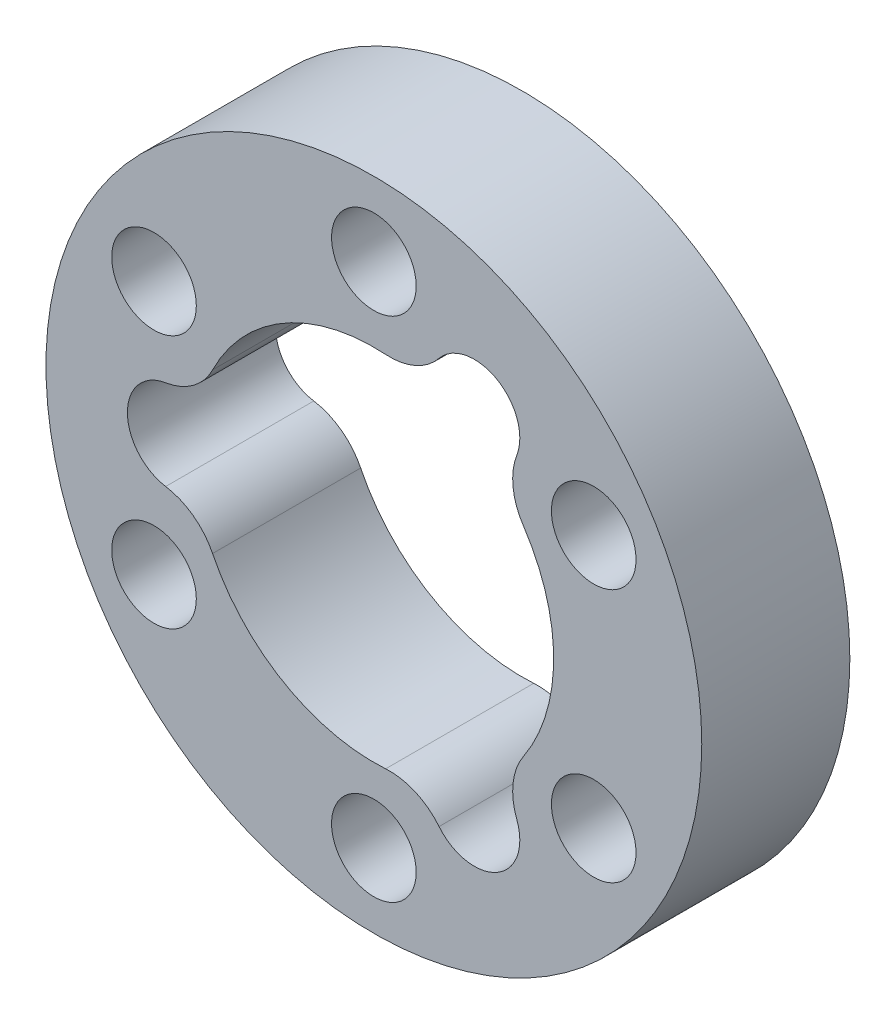
ISO-10303-21;
HEADER;
FILE_DESCRIPTION(('STEP AP214'),'2;1');
FILE_NAME('part.step','',(''),(''),'','','');
FILE_SCHEMA(('AUTOMOTIVE_DESIGN { 1 0 10303 214 1 1 1 1 }'));
ENDSEC;
DATA;
#1=APPLICATION_CONTEXT('core data for automotive mechanical design processes');
#2=APPLICATION_PROTOCOL_DEFINITION('international standard','automotive_design',2000,#1);
#3=PRODUCT_CONTEXT('',#1,'mechanical');
#4=PRODUCT('Part','Part','',(#3));
#5=PRODUCT_RELATED_PRODUCT_CATEGORY('part','',(#4));
#6=PRODUCT_DEFINITION_FORMATION('','',#4);
#7=PRODUCT_DEFINITION_CONTEXT('part definition',#1,'design');
#8=PRODUCT_DEFINITION('design','',#6,#7);
#9=PRODUCT_DEFINITION_SHAPE('','',#8);
#10=(LENGTH_UNIT() NAMED_UNIT(*) SI_UNIT(.MILLI.,.METRE.));
#11=(NAMED_UNIT(*) PLANE_ANGLE_UNIT() SI_UNIT($,.RADIAN.));
#12=(NAMED_UNIT(*) SI_UNIT($,.STERADIAN.) SOLID_ANGLE_UNIT());
#13=UNCERTAINTY_MEASURE_WITH_UNIT(LENGTH_MEASURE(1.E-05),#10,'distance_accuracy_value','');
#14=(GEOMETRIC_REPRESENTATION_CONTEXT(3) GLOBAL_UNCERTAINTY_ASSIGNED_CONTEXT((#13)) GLOBAL_UNIT_ASSIGNED_CONTEXT((#10,
#11,#12)) REPRESENTATION_CONTEXT('',''));
#15=CARTESIAN_POINT('',(0.,0.,0.));
#16=DIRECTION('',(0.,0.,1.));
#17=DIRECTION('',(1.,0.,0.));
#18=AXIS2_PLACEMENT_3D('',#15,#16,#17);
#19=CARTESIAN_POINT('',(0.,0.,7.));
#20=DIRECTION('',(0.,0.,-1.));
#21=DIRECTION('',(-1.,0.,0.));
#22=AXIS2_PLACEMENT_3D('',#19,#20,#21);
#23=CYLINDRICAL_SURFACE('',#22,8.5);
#24=CARTESIAN_POINT('',(0.,0.,0.));
#25=DIRECTION('',(0.,0.,1.));
#26=DIRECTION('',(1.,0.,0.));
#27=AXIS2_PLACEMENT_3D('',#24,#25,#26);
#28=CIRCLE('',#27,8.5);
#29=CARTESIAN_POINT('',(0.556875109542722,8.48173862556326,0.));
#30=VERTEX_POINT('',#29);
#31=CARTESIAN_POINT('',(-7.6238386727689,3.75860132118229,0.));
#32=VERTEX_POINT('',#31);
#33=EDGE_CURVE('E142',#30,#32,#28,.T.);
#34=ORIENTED_EDGE('',*,*,#33,.F.);
#35=DIRECTION('',(0.,0.,-1.));
#36=VECTOR('',#35,1.);
#37=CARTESIAN_POINT('',(0.556875109542722,8.48173862556326,7.));
#38=LINE('',#37,#36);
#39=CARTESIAN_POINT('',(0.556875109542722,8.48173862556326,7.));
#40=VERTEX_POINT('',#39);
#41=EDGE_CURVE('E11',#30,#40,#38,.F.);
#42=ORIENTED_EDGE('',*,*,#41,.T.);
#43=CARTESIAN_POINT('',(0.,0.,7.));
#44=DIRECTION('',(0.,0.,1.));
#45=DIRECTION('',(1.,0.,0.));
#46=AXIS2_PLACEMENT_3D('',#43,#44,#45);
#47=CIRCLE('',#46,8.5);
#48=CARTESIAN_POINT('',(-7.6238386727689,3.75860132118229,7.));
#49=VERTEX_POINT('',#48);
#50=EDGE_CURVE('E238',#40,#49,#47,.T.);
#51=ORIENTED_EDGE('',*,*,#50,.T.);
#52=DIRECTION('',(0.,0.,-1.));
#53=VECTOR('',#52,1.);
#54=CARTESIAN_POINT('',(-7.6238386727689,3.75860132118229,7.));
#55=LINE('',#54,#53);
#56=EDGE_CURVE('E54',#49,#32,#55,.T.);
#57=ORIENTED_EDGE('',*,*,#56,.T.);
#58=EDGE_LOOP('',(#34,#42,#51,#57));
#59=FACE_BOUND('',#58,.T.);
#60=ADVANCED_FACE('F45',(#59),#23,.F.);
#61=CARTESIAN_POINT('',(4.74999999999995,8.2272413359522,7.));
#62=DIRECTION('',(0.,0.,-1.));
#63=DIRECTION('',(-1.,0.,0.));
#64=AXIS2_PLACEMENT_3D('',#61,#62,#63);
#65=CYLINDRICAL_SURFACE('',#64,2.15);
#66=CARTESIAN_POINT('',(4.74999999999995,8.2272413359522,0.));
#67=DIRECTION('',(0.,0.,1.));
#68=DIRECTION('',(1.,0.,0.));
#69=AXIS2_PLACEMENT_3D('',#66,#67,#68);
#70=CIRCLE('',#69,2.15);
#71=CARTESIAN_POINT('',(6.75855337751601,7.46029066630726,0.));
#72=VERTEX_POINT('',#71);
#73=CARTESIAN_POINT('',(3.0815245478799,9.58322425091565,0.));
#74=VERTEX_POINT('',#73);
#75=EDGE_CURVE('E293',#72,#74,#70,.T.);
#76=ORIENTED_EDGE('',*,*,#75,.F.);
#77=DIRECTION('',(0.,0.,-1.));
#78=VECTOR('',#77,1.);
#79=CARTESIAN_POINT('',(6.75855337751601,7.46029066630726,7.));
#80=LINE('',#79,#78);
#81=CARTESIAN_POINT('',(6.75855337751601,7.46029066630726,7.));
#82=VERTEX_POINT('',#81);
#83=EDGE_CURVE('E231',#72,#82,#80,.F.);
#84=ORIENTED_EDGE('',*,*,#83,.T.);
#85=CARTESIAN_POINT('',(4.74999999999995,8.2272413359522,7.));
#86=DIRECTION('',(0.,0.,1.));
#87=DIRECTION('',(1.,0.,0.));
#88=AXIS2_PLACEMENT_3D('',#85,#86,#87);
#89=CIRCLE('',#88,2.15);
#90=CARTESIAN_POINT('',(3.0815245478799,9.58322425091565,7.));
#91=VERTEX_POINT('',#90);
#92=EDGE_CURVE('E241',#82,#91,#89,.T.);
#93=ORIENTED_EDGE('',*,*,#92,.T.);
#94=DIRECTION('',(0.,0.,-1.));
#95=VECTOR('',#94,1.);
#96=CARTESIAN_POINT('',(3.0815245478799,9.58322425091565,7.));
#97=LINE('',#96,#95);
#98=EDGE_CURVE('E227',#91,#74,#97,.T.);
#99=ORIENTED_EDGE('',*,*,#98,.T.);
#100=EDGE_LOOP('',(#76,#84,#93,#99));
#101=FACE_BOUND('',#100,.T.);
#102=ADVANCED_FACE('F343',(#101),#65,.F.);
#103=CARTESIAN_POINT('',(7.06696356322613,-4.72313730438087,0.));
#104=VERTEX_POINT('',#103);
#105=CARTESIAN_POINT('',(7.06696356322608,4.72313730438096,0.));
#106=VERTEX_POINT('',#105);
#107=EDGE_CURVE('E288',#104,#106,#28,.T.);
#108=ORIENTED_EDGE('',*,*,#107,.F.);
#109=DIRECTION('',(0.,0.,-1.));
#110=VECTOR('',#109,1.);
#111=CARTESIAN_POINT('',(7.06696356322613,-4.72313730438087,7.));
#112=LINE('',#111,#110);
#113=CARTESIAN_POINT('',(7.06696356322613,-4.72313730438087,7.));
#114=VERTEX_POINT('',#113);
#115=EDGE_CURVE('E224',#104,#114,#112,.F.);
#116=ORIENTED_EDGE('',*,*,#115,.T.);
#117=CARTESIAN_POINT('',(7.06696356322608,4.72313730438096,7.));
#118=VERTEX_POINT('',#117);
#119=EDGE_CURVE('E244',#114,#118,#47,.T.);
#120=ORIENTED_EDGE('',*,*,#119,.T.);
#121=DIRECTION('',(0.,0.,-1.));
#122=VECTOR('',#121,1.);
#123=CARTESIAN_POINT('',(7.06696356322608,4.72313730438096,7.));
#124=LINE('',#123,#122);
#125=EDGE_CURVE('E220',#118,#106,#124,.T.);
#126=ORIENTED_EDGE('',*,*,#125,.T.);
#127=EDGE_LOOP('',(#108,#116,#120,#126));
#128=FACE_BOUND('',#127,.T.);
#129=ADVANCED_FACE('F340',(#128),#23,.F.);
#130=CARTESIAN_POINT('',(4.75000000000005,-8.22724133595214,7.));
#131=DIRECTION('',(0.,0.,-1.));
#132=DIRECTION('',(-1.,0.,0.));
#133=AXIS2_PLACEMENT_3D('',#130,#131,#132);
#134=CYLINDRICAL_SURFACE('',#133,2.15);
#135=CARTESIAN_POINT('',(4.75000000000005,-8.22724133595214,0.));
#136=DIRECTION('',(0.,0.,1.));
#137=DIRECTION('',(1.,0.,0.));
#138=AXIS2_PLACEMENT_3D('',#135,#136,#137);
#139=CIRCLE('',#138,2.15);
#140=CARTESIAN_POINT('',(3.08152454788002,-9.58322425091561,0.));
#141=VERTEX_POINT('',#140);
#142=CARTESIAN_POINT('',(6.7585533775161,-7.46029066630717,0.));
#143=VERTEX_POINT('',#142);
#144=EDGE_CURVE('E292',#141,#143,#139,.T.);
#145=ORIENTED_EDGE('',*,*,#144,.F.);
#146=DIRECTION('',(0.,0.,-1.));
#147=VECTOR('',#146,1.);
#148=CARTESIAN_POINT('',(3.08152454788002,-9.58322425091561,7.));
#149=LINE('',#148,#147);
#150=CARTESIAN_POINT('',(3.08152454788002,-9.58322425091561,7.));
#151=VERTEX_POINT('',#150);
#152=EDGE_CURVE('E68',#141,#151,#149,.F.);
#153=ORIENTED_EDGE('',*,*,#152,.T.);
#154=CARTESIAN_POINT('',(4.75000000000005,-8.22724133595214,7.));
#155=DIRECTION('',(0.,0.,1.));
#156=DIRECTION('',(1.,0.,0.));
#157=AXIS2_PLACEMENT_3D('',#154,#155,#156);
#158=CIRCLE('',#157,2.15);
#159=CARTESIAN_POINT('',(6.7585533775161,-7.46029066630717,7.));
#160=VERTEX_POINT('',#159);
#161=EDGE_CURVE('E254',#151,#160,#158,.T.);
#162=ORIENTED_EDGE('',*,*,#161,.T.);
#163=DIRECTION('',(0.,0.,-1.));
#164=VECTOR('',#163,1.);
#165=CARTESIAN_POINT('',(6.75855337751611,-7.46029066630717,7.));
#166=LINE('',#165,#164);
#167=EDGE_CURVE('E214',#160,#143,#166,.T.);
#168=ORIENTED_EDGE('',*,*,#167,.T.);
#169=EDGE_LOOP('',(#145,#153,#162,#168));
#170=FACE_BOUND('',#169,.T.);
#171=ADVANCED_FACE('F337',(#170),#134,.F.);
#172=CARTESIAN_POINT('',(-7.62383867276885,-3.7586013211824,0.));
#173=VERTEX_POINT('',#172);
#174=CARTESIAN_POINT('',(0.556875109542829,-8.48173862556326,0.));
#175=VERTEX_POINT('',#174);
#176=EDGE_CURVE('E160',#173,#175,#28,.T.);
#177=ORIENTED_EDGE('',*,*,#176,.F.);
#178=DIRECTION('',(0.,0.,-1.));
#179=VECTOR('',#178,1.);
#180=CARTESIAN_POINT('',(-7.62383867276885,-3.7586013211824,7.));
#181=LINE('',#180,#179);
#182=CARTESIAN_POINT('',(-7.62383867276885,-3.7586013211824,7.));
#183=VERTEX_POINT('',#182);
#184=EDGE_CURVE('E195',#173,#183,#181,.F.);
#185=ORIENTED_EDGE('',*,*,#184,.T.);
#186=CARTESIAN_POINT('',(0.556875109542829,-8.48173862556326,7.));
#187=VERTEX_POINT('',#186);
#188=EDGE_CURVE('E243',#183,#187,#47,.T.);
#189=ORIENTED_EDGE('',*,*,#188,.T.);
#190=DIRECTION('',(0.,0.,-1.));
#191=VECTOR('',#190,1.);
#192=CARTESIAN_POINT('',(0.556875109542829,-8.48173862556326,7.));
#193=LINE('',#192,#191);
#194=EDGE_CURVE('E191',#187,#175,#193,.T.);
#195=ORIENTED_EDGE('',*,*,#194,.T.);
#196=EDGE_LOOP('',(#177,#185,#189,#195));
#197=FACE_BOUND('',#196,.T.);
#198=ADVANCED_FACE('F327',(#197),#23,.F.);
#199=CARTESIAN_POINT('',(-10.3923048454133,5.99999999999999,7.));
#200=DIRECTION('',(0.,0.,-1.));
#201=DIRECTION('',(-1.,0.,0.));
#202=AXIS2_PLACEMENT_3D('',#199,#200,#201);
#203=CYLINDRICAL_SURFACE('',#202,2.);
#204=CARTESIAN_POINT('',(-10.3923048454133,5.99999999999999,7.));
#205=DIRECTION('',(0.,0.,1.));
#206=DIRECTION('',(1.,0.,0.));
#207=AXIS2_PLACEMENT_3D('',#204,#205,#206);
#208=CIRCLE('',#207,2.);
#209=CARTESIAN_POINT('',(-8.39230484541327,5.99999999999999,7.));
#210=VERTEX_POINT('',#209);
#211=EDGE_CURVE('E171',#210,#210,#208,.T.);
#212=ORIENTED_EDGE('',*,*,#211,.T.);
#213=EDGE_LOOP('',(#212));
#214=FACE_BOUND('',#213,.T.);
#215=CARTESIAN_POINT('',(-10.3923048454133,5.99999999999999,0.));
#216=DIRECTION('',(0.,0.,1.));
#217=DIRECTION('',(1.,0.,0.));
#218=AXIS2_PLACEMENT_3D('',#215,#216,#217);
#219=CIRCLE('',#218,2.);
#220=CARTESIAN_POINT('',(-8.39230484541327,5.99999999999999,0.));
#221=VERTEX_POINT('',#220);
#222=EDGE_CURVE('E250',#221,#221,#219,.T.);
#223=ORIENTED_EDGE('',*,*,#222,.F.);
#224=EDGE_LOOP('',(#223));
#225=FACE_BOUND('',#224,.T.);
#226=ADVANCED_FACE('F324',(#214,#225),#203,.F.);
#227=CARTESIAN_POINT('',(-10.3923048454133,-6.00000000000001,7.));
#228=DIRECTION('',(0.,0.,-1.));
#229=DIRECTION('',(-1.,0.,0.));
#230=AXIS2_PLACEMENT_3D('',#227,#228,#229);
#231=CYLINDRICAL_SURFACE('',#230,2.);
#232=CARTESIAN_POINT('',(-10.3923048454133,-6.00000000000001,7.));
#233=DIRECTION('',(0.,0.,1.));
#234=DIRECTION('',(1.,0.,0.));
#235=AXIS2_PLACEMENT_3D('',#232,#233,#234);
#236=CIRCLE('',#235,2.);
#237=CARTESIAN_POINT('',(-8.39230484541326,-6.00000000000001,7.));
#238=VERTEX_POINT('',#237);
#239=EDGE_CURVE('E281',#238,#238,#236,.T.);
#240=ORIENTED_EDGE('',*,*,#239,.T.);
#241=EDGE_LOOP('',(#240));
#242=FACE_BOUND('',#241,.T.);
#243=CARTESIAN_POINT('',(-10.3923048454133,-6.00000000000001,0.));
#244=DIRECTION('',(0.,0.,1.));
#245=DIRECTION('',(1.,0.,0.));
#246=AXIS2_PLACEMENT_3D('',#243,#244,#245);
#247=CIRCLE('',#246,2.);
#248=CARTESIAN_POINT('',(-8.39230484541326,-6.00000000000001,0.));
#249=VERTEX_POINT('',#248);
#250=EDGE_CURVE('E315',#249,#249,#247,.T.);
#251=ORIENTED_EDGE('',*,*,#250,.F.);
#252=EDGE_LOOP('',(#251));
#253=FACE_BOUND('',#252,.T.);
#254=ADVANCED_FACE('F326',(#242,#253),#231,.F.);
#255=CARTESIAN_POINT('',(0.,-12.,7.));
#256=DIRECTION('',(0.,0.,-1.));
#257=DIRECTION('',(-1.,0.,0.));
#258=AXIS2_PLACEMENT_3D('',#255,#256,#257);
#259=CYLINDRICAL_SURFACE('',#258,2.);
#260=CARTESIAN_POINT('',(0.,-12.,7.));
#261=DIRECTION('',(0.,0.,1.));
#262=DIRECTION('',(1.,0.,0.));
#263=AXIS2_PLACEMENT_3D('',#260,#261,#262);
#264=CIRCLE('',#263,2.);
#265=CARTESIAN_POINT('',(2.,-12.,7.));
#266=VERTEX_POINT('',#265);
#267=EDGE_CURVE('E277',#266,#266,#264,.T.);
#268=ORIENTED_EDGE('',*,*,#267,.T.);
#269=EDGE_LOOP('',(#268));
#270=FACE_BOUND('',#269,.T.);
#271=CARTESIAN_POINT('',(0.,-12.,0.));
#272=DIRECTION('',(0.,0.,1.));
#273=DIRECTION('',(1.,0.,0.));
#274=AXIS2_PLACEMENT_3D('',#271,#272,#273);
#275=CIRCLE('',#274,2.);
#276=CARTESIAN_POINT('',(2.,-12.,0.));
#277=VERTEX_POINT('',#276);
#278=EDGE_CURVE('E311',#277,#277,#275,.T.);
#279=ORIENTED_EDGE('',*,*,#278,.F.);
#280=EDGE_LOOP('',(#279));
#281=FACE_BOUND('',#280,.T.);
#282=ADVANCED_FACE('F334',(#270,#281),#259,.F.);
#283=CARTESIAN_POINT('',(10.3923048454133,-6.,7.));
#284=DIRECTION('',(0.,0.,-1.));
#285=DIRECTION('',(-1.,0.,0.));
#286=AXIS2_PLACEMENT_3D('',#283,#284,#285);
#287=CYLINDRICAL_SURFACE('',#286,2.);
#288=CARTESIAN_POINT('',(10.3923048454133,-6.,7.));
#289=DIRECTION('',(0.,0.,1.));
#290=DIRECTION('',(1.,0.,0.));
#291=AXIS2_PLACEMENT_3D('',#288,#289,#290);
#292=CIRCLE('',#291,2.);
#293=CARTESIAN_POINT('',(12.3923048454133,-6.,7.));
#294=VERTEX_POINT('',#293);
#295=EDGE_CURVE('E273',#294,#294,#292,.T.);
#296=ORIENTED_EDGE('',*,*,#295,.T.);
#297=EDGE_LOOP('',(#296));
#298=FACE_BOUND('',#297,.T.);
#299=CARTESIAN_POINT('',(10.3923048454133,-6.,0.));
#300=DIRECTION('',(0.,0.,1.));
#301=DIRECTION('',(1.,0.,0.));
#302=AXIS2_PLACEMENT_3D('',#299,#300,#301);
#303=CIRCLE('',#302,2.);
#304=CARTESIAN_POINT('',(12.3923048454133,-6.,0.));
#305=VERTEX_POINT('',#304);
#306=EDGE_CURVE('E307',#305,#305,#303,.T.);
#307=ORIENTED_EDGE('',*,*,#306,.F.);
#308=EDGE_LOOP('',(#307));
#309=FACE_BOUND('',#308,.T.);
#310=ADVANCED_FACE('F518',(#298,#309),#287,.F.);
#311=CARTESIAN_POINT('',(10.3923048454133,6.,7.));
#312=DIRECTION('',(0.,0.,-1.));
#313=DIRECTION('',(-1.,0.,0.));
#314=AXIS2_PLACEMENT_3D('',#311,#312,#313);
#315=CYLINDRICAL_SURFACE('',#314,2.);
#316=CARTESIAN_POINT('',(10.3923048454133,6.,7.));
#317=DIRECTION('',(0.,0.,1.));
#318=DIRECTION('',(1.,0.,0.));
#319=AXIS2_PLACEMENT_3D('',#316,#317,#318);
#320=CIRCLE('',#319,2.);
#321=CARTESIAN_POINT('',(12.3923048454133,6.,7.));
#322=VERTEX_POINT('',#321);
#323=EDGE_CURVE('E269',#322,#322,#320,.T.);
#324=ORIENTED_EDGE('',*,*,#323,.T.);
#325=EDGE_LOOP('',(#324));
#326=FACE_BOUND('',#325,.T.);
#327=CARTESIAN_POINT('',(10.3923048454133,6.,0.));
#328=DIRECTION('',(0.,0.,1.));
#329=DIRECTION('',(1.,0.,0.));
#330=AXIS2_PLACEMENT_3D('',#327,#328,#329);
#331=CIRCLE('',#330,2.);
#332=CARTESIAN_POINT('',(12.3923048454133,6.,0.));
#333=VERTEX_POINT('',#332);
#334=EDGE_CURVE('E303',#333,#333,#331,.T.);
#335=ORIENTED_EDGE('',*,*,#334,.F.);
#336=EDGE_LOOP('',(#335));
#337=FACE_BOUND('',#336,.T.);
#338=ADVANCED_FACE('F507',(#326,#337),#315,.F.);
#339=CARTESIAN_POINT('',(0.,12.,7.));
#340=DIRECTION('',(0.,0.,-1.));
#341=DIRECTION('',(-1.,0.,0.));
#342=AXIS2_PLACEMENT_3D('',#339,#340,#341);
#343=CYLINDRICAL_SURFACE('',#342,2.);
#344=CARTESIAN_POINT('',(0.,12.,7.));
#345=DIRECTION('',(0.,0.,1.));
#346=DIRECTION('',(1.,0.,0.));
#347=AXIS2_PLACEMENT_3D('',#344,#345,#346);
#348=CIRCLE('',#347,2.);
#349=CARTESIAN_POINT('',(2.,12.,7.));
#350=VERTEX_POINT('',#349);
#351=EDGE_CURVE('E265',#350,#350,#348,.T.);
#352=ORIENTED_EDGE('',*,*,#351,.T.);
#353=EDGE_LOOP('',(#352));
#354=FACE_BOUND('',#353,.T.);
#355=CARTESIAN_POINT('',(0.,12.,0.));
#356=DIRECTION('',(0.,0.,1.));
#357=DIRECTION('',(1.,0.,0.));
#358=AXIS2_PLACEMENT_3D('',#355,#356,#357);
#359=CIRCLE('',#358,2.);
#360=CARTESIAN_POINT('',(2.,12.,0.));
#361=VERTEX_POINT('',#360);
#362=EDGE_CURVE('E159',#361,#361,#359,.T.);
#363=ORIENTED_EDGE('',*,*,#362,.F.);
#364=EDGE_LOOP('',(#363));
#365=FACE_BOUND('',#364,.T.);
#366=ADVANCED_FACE('F459',(#354,#365),#343,.F.);
#367=CARTESIAN_POINT('',(-9.5,0.,7.));
#368=DIRECTION('',(0.,0.,-1.));
#369=DIRECTION('',(-1.,0.,0.));
#370=AXIS2_PLACEMENT_3D('',#367,#368,#369);
#371=CYLINDRICAL_SURFACE('',#370,2.15);
#372=CARTESIAN_POINT('',(-9.5,0.,7.));
#373=DIRECTION('',(0.,0.,1.));
#374=DIRECTION('',(1.,0.,0.));
#375=AXIS2_PLACEMENT_3D('',#372,#373,#374);
#376=CIRCLE('',#375,2.15);
#377=CARTESIAN_POINT('',(-9.84007792539603,2.12293358460835,7.));
#378=VERTEX_POINT('',#377);
#379=CARTESIAN_POINT('',(-9.840077925396,-2.12293358460848,7.));
#380=VERTEX_POINT('',#379);
#381=EDGE_CURVE('E253',#378,#380,#376,.T.);
#382=ORIENTED_EDGE('',*,*,#381,.T.);
#383=DIRECTION('',(0.,0.,-1.));
#384=VECTOR('',#383,1.);
#385=CARTESIAN_POINT('',(-9.840077925396,-2.12293358460848,7.));
#386=LINE('',#385,#384);
#387=CARTESIAN_POINT('',(-9.840077925396,-2.12293358460848,0.));
#388=VERTEX_POINT('',#387);
#389=EDGE_CURVE('E149',#380,#388,#386,.T.);
#390=ORIENTED_EDGE('',*,*,#389,.T.);
#391=CARTESIAN_POINT('',(-9.5,0.,0.));
#392=DIRECTION('',(0.,0.,1.));
#393=DIRECTION('',(1.,0.,0.));
#394=AXIS2_PLACEMENT_3D('',#391,#392,#393);
#395=CIRCLE('',#394,2.15);
#396=CARTESIAN_POINT('',(-9.84007792539603,2.12293358460835,0.));
#397=VERTEX_POINT('',#396);
#398=EDGE_CURVE('E140',#397,#388,#395,.T.);
#399=ORIENTED_EDGE('',*,*,#398,.F.);
#400=DIRECTION('',(0.,0.,-1.));
#401=VECTOR('',#400,1.);
#402=CARTESIAN_POINT('',(-9.84007792539603,2.12293358460835,7.));
#403=LINE('',#402,#401);
#404=EDGE_CURVE('E155',#397,#378,#403,.F.);
#405=ORIENTED_EDGE('',*,*,#404,.T.);
#406=EDGE_LOOP('',(#382,#390,#399,#405));
#407=FACE_BOUND('',#406,.T.);
#408=ADVANCED_FACE('F154',(#407),#371,.F.);
#409=CARTESIAN_POINT('',(0.,0.,7.));
#410=DIRECTION('',(0.,0.,-1.));
#411=DIRECTION('',(-1.,0.,0.));
#412=AXIS2_PLACEMENT_3D('',#409,#410,#411);
#413=CYLINDRICAL_SURFACE('',#412,15.5);
#414=CARTESIAN_POINT('',(0.,0.,7.));
#415=DIRECTION('',(0.,0.,1.));
#416=DIRECTION('',(1.,0.,0.));
#417=AXIS2_PLACEMENT_3D('',#414,#415,#416);
#418=CIRCLE('',#417,15.5);
#419=CARTESIAN_POINT('',(15.5,0.,7.));
#420=VERTEX_POINT('',#419);
#421=EDGE_CURVE('E165',#420,#420,#418,.T.);
#422=ORIENTED_EDGE('',*,*,#421,.F.);
#423=EDGE_LOOP('',(#422));
#424=FACE_BOUND('',#423,.T.);
#425=CARTESIAN_POINT('',(0.,0.,0.));
#426=DIRECTION('',(0.,0.,1.));
#427=DIRECTION('',(1.,0.,0.));
#428=AXIS2_PLACEMENT_3D('',#425,#426,#427);
#429=CIRCLE('',#428,15.5);
#430=CARTESIAN_POINT('',(15.5,0.,0.));
#431=VERTEX_POINT('',#430);
#432=EDGE_CURVE('E174',#431,#431,#429,.T.);
#433=ORIENTED_EDGE('',*,*,#432,.T.);
#434=EDGE_LOOP('',(#433));
#435=FACE_BOUND('',#434,.T.);
#436=ADVANCED_FACE('F447',(#424,#435),#413,.T.);
#437=CARTESIAN_POINT('',(0.,0.,7.));
#438=DIRECTION('',(0.,0.,1.));
#439=DIRECTION('',(1.,0.,0.));
#440=AXIS2_PLACEMENT_3D('',#437,#438,#439);
#441=PLANE('',#440);
#442=ORIENTED_EDGE('',*,*,#188,.F.);
#443=CARTESIAN_POINT('',(-10.3146052631579,-5.08516649336442,7.));
#444=DIRECTION('',(0.,0.,1.));
#445=DIRECTION('',(1.,0.,0.));
#446=AXIS2_PLACEMENT_3D('',#443,#444,#445);
#447=CIRCLE('',#446,3.);
#448=EDGE_CURVE('E211',#183,#380,#447,.T.);
#449=ORIENTED_EDGE('',*,*,#448,.T.);
#450=ORIENTED_EDGE('',*,*,#381,.F.);
#451=CARTESIAN_POINT('',(-10.3146052631579,5.08516649336428,7.));
#452=DIRECTION('',(0.,0.,1.));
#453=DIRECTION('',(1.,0.,0.));
#454=AXIS2_PLACEMENT_3D('',#451,#452,#453);
#455=CIRCLE('',#454,3.);
#456=EDGE_CURVE('E163',#378,#49,#455,.T.);
#457=ORIENTED_EDGE('',*,*,#456,.T.);
#458=ORIENTED_EDGE('',*,*,#50,.F.);
#459=CARTESIAN_POINT('',(0.753419265851918,11.4752934345856,7.));
#460=DIRECTION('',(0.,0.,1.));
#461=DIRECTION('',(1.,0.,0.));
#462=AXIS2_PLACEMENT_3D('',#459,#460,#461);
#463=CIRCLE('',#462,3.);
#464=EDGE_CURVE('E200',#40,#91,#463,.T.);
#465=ORIENTED_EDGE('',*,*,#464,.T.);
#466=ORIENTED_EDGE('',*,*,#92,.F.);
#467=CARTESIAN_POINT('',(9.56118599730586,6.3901269412213,7.));
#468=DIRECTION('',(0.,0.,1.));
#469=DIRECTION('',(1.,0.,0.));
#470=AXIS2_PLACEMENT_3D('',#467,#468,#469);
#471=CIRCLE('',#470,3.);
#472=EDGE_CURVE('E203',#82,#118,#471,.T.);
#473=ORIENTED_EDGE('',*,*,#472,.T.);
#474=ORIENTED_EDGE('',*,*,#119,.F.);
#475=CARTESIAN_POINT('',(9.56118599730595,-6.39012694122118,7.));
#476=DIRECTION('',(0.,0.,1.));
#477=DIRECTION('',(1.,0.,0.));
#478=AXIS2_PLACEMENT_3D('',#475,#476,#477);
#479=CIRCLE('',#478,3.);
#480=EDGE_CURVE('E61',#114,#160,#479,.T.);
#481=ORIENTED_EDGE('',*,*,#480,.T.);
#482=ORIENTED_EDGE('',*,*,#161,.F.);
#483=CARTESIAN_POINT('',(0.753419265852063,-11.4752934345856,7.));
#484=DIRECTION('',(0.,0.,1.));
#485=DIRECTION('',(1.,0.,0.));
#486=AXIS2_PLACEMENT_3D('',#483,#484,#485);
#487=CIRCLE('',#486,3.);
#488=EDGE_CURVE('E208',#151,#187,#487,.T.);
#489=ORIENTED_EDGE('',*,*,#488,.T.);
#490=EDGE_LOOP('',(#442,#449,#450,#457,#458,#465,#466,#473,#474,#481,#482,#489));
#491=FACE_BOUND('',#490,.T.);
#492=ORIENTED_EDGE('',*,*,#351,.F.);
#493=EDGE_LOOP('',(#492));
#494=FACE_BOUND('',#493,.T.);
#495=ORIENTED_EDGE('',*,*,#323,.F.);
#496=EDGE_LOOP('',(#495));
#497=FACE_BOUND('',#496,.T.);
#498=ORIENTED_EDGE('',*,*,#295,.F.);
#499=EDGE_LOOP('',(#498));
#500=FACE_BOUND('',#499,.T.);
#501=ORIENTED_EDGE('',*,*,#267,.F.);
#502=EDGE_LOOP('',(#501));
#503=FACE_BOUND('',#502,.T.);
#504=ORIENTED_EDGE('',*,*,#239,.F.);
#505=EDGE_LOOP('',(#504));
#506=FACE_BOUND('',#505,.T.);
#507=ORIENTED_EDGE('',*,*,#211,.F.);
#508=EDGE_LOOP('',(#507));
#509=FACE_BOUND('',#508,.T.);
#510=ORIENTED_EDGE('',*,*,#421,.T.);
#511=EDGE_LOOP('',(#510));
#512=FACE_BOUND('',#511,.T.);
#513=ADVANCED_FACE('F368',(#491,#494,#497,#500,#503,#506,#509,#512),#441,.T.);
#514=CARTESIAN_POINT('',(0.,0.,0.));
#515=DIRECTION('',(0.,0.,1.));
#516=DIRECTION('',(1.,0.,0.));
#517=AXIS2_PLACEMENT_3D('',#514,#515,#516);
#518=PLANE('',#517);
#519=ORIENTED_EDGE('',*,*,#398,.T.);
#520=CARTESIAN_POINT('',(-10.3146052631579,-5.08516649336442,0.));
#521=DIRECTION('',(0.,0.,1.));
#522=DIRECTION('',(1.,0.,0.));
#523=AXIS2_PLACEMENT_3D('',#520,#521,#522);
#524=CIRCLE('',#523,3.);
#525=EDGE_CURVE('E188',#388,#173,#524,.F.);
#526=ORIENTED_EDGE('',*,*,#525,.T.);
#527=ORIENTED_EDGE('',*,*,#176,.T.);
#528=CARTESIAN_POINT('',(0.753419265852063,-11.4752934345856,0.));
#529=DIRECTION('',(0.,0.,1.));
#530=DIRECTION('',(1.,0.,0.));
#531=AXIS2_PLACEMENT_3D('',#528,#529,#530);
#532=CIRCLE('',#531,3.);
#533=EDGE_CURVE('E185',#175,#141,#532,.F.);
#534=ORIENTED_EDGE('',*,*,#533,.T.);
#535=ORIENTED_EDGE('',*,*,#144,.T.);
#536=CARTESIAN_POINT('',(9.56118599730595,-6.39012694122118,0.));
#537=DIRECTION('',(0.,0.,1.));
#538=DIRECTION('',(1.,0.,0.));
#539=AXIS2_PLACEMENT_3D('',#536,#537,#538);
#540=CIRCLE('',#539,3.);
#541=EDGE_CURVE('E182',#143,#104,#540,.F.);
#542=ORIENTED_EDGE('',*,*,#541,.T.);
#543=ORIENTED_EDGE('',*,*,#107,.T.);
#544=CARTESIAN_POINT('',(9.56118599730586,6.3901269412213,0.));
#545=DIRECTION('',(0.,0.,1.));
#546=DIRECTION('',(1.,0.,0.));
#547=AXIS2_PLACEMENT_3D('',#544,#545,#546);
#548=CIRCLE('',#547,3.);
#549=EDGE_CURVE('E179',#106,#72,#548,.F.);
#550=ORIENTED_EDGE('',*,*,#549,.T.);
#551=ORIENTED_EDGE('',*,*,#75,.T.);
#552=CARTESIAN_POINT('',(0.753419265851918,11.4752934345856,0.));
#553=DIRECTION('',(0.,0.,1.));
#554=DIRECTION('',(1.,0.,0.));
#555=AXIS2_PLACEMENT_3D('',#552,#553,#554);
#556=CIRCLE('',#555,3.);
#557=EDGE_CURVE('E148',#74,#30,#556,.F.);
#558=ORIENTED_EDGE('',*,*,#557,.T.);
#559=ORIENTED_EDGE('',*,*,#33,.T.);
#560=CARTESIAN_POINT('',(-10.3146052631579,5.08516649336428,0.));
#561=DIRECTION('',(0.,0.,1.));
#562=DIRECTION('',(1.,0.,0.));
#563=AXIS2_PLACEMENT_3D('',#560,#561,#562);
#564=CIRCLE('',#563,3.);
#565=EDGE_CURVE('E136',#32,#397,#564,.F.);
#566=ORIENTED_EDGE('',*,*,#565,.T.);
#567=EDGE_LOOP('',(#519,#526,#527,#534,#535,#542,#543,#550,#551,#558,#559,#566));
#568=FACE_BOUND('',#567,.T.);
#569=ORIENTED_EDGE('',*,*,#362,.T.);
#570=EDGE_LOOP('',(#569));
#571=FACE_BOUND('',#570,.T.);
#572=ORIENTED_EDGE('',*,*,#334,.T.);
#573=EDGE_LOOP('',(#572));
#574=FACE_BOUND('',#573,.T.);
#575=ORIENTED_EDGE('',*,*,#306,.T.);
#576=EDGE_LOOP('',(#575));
#577=FACE_BOUND('',#576,.T.);
#578=ORIENTED_EDGE('',*,*,#278,.T.);
#579=EDGE_LOOP('',(#578));
#580=FACE_BOUND('',#579,.T.);
#581=ORIENTED_EDGE('',*,*,#250,.T.);
#582=EDGE_LOOP('',(#581));
#583=FACE_BOUND('',#582,.T.);
#584=ORIENTED_EDGE('',*,*,#222,.T.);
#585=EDGE_LOOP('',(#584));
#586=FACE_BOUND('',#585,.T.);
#587=ORIENTED_EDGE('',*,*,#432,.F.);
#588=EDGE_LOOP('',(#587));
#589=FACE_BOUND('',#588,.T.);
#590=ADVANCED_FACE('F138',(#568,#571,#574,#577,#580,#583,#586,#589),#518,.F.);
#591=CARTESIAN_POINT('',(-10.3146052631579,-5.08516649336442,7.));
#592=DIRECTION('',(0.,0.,-1.));
#593=DIRECTION('',(-1.,0.,0.));
#594=AXIS2_PLACEMENT_3D('',#591,#592,#593);
#595=CYLINDRICAL_SURFACE('',#594,3.);
#596=ORIENTED_EDGE('',*,*,#448,.F.);
#597=ORIENTED_EDGE('',*,*,#184,.F.);
#598=ORIENTED_EDGE('',*,*,#525,.F.);
#599=ORIENTED_EDGE('',*,*,#389,.F.);
#600=EDGE_LOOP('',(#596,#597,#598,#599));
#601=FACE_BOUND('',#600,.T.);
#602=ADVANCED_FACE('F371',(#601),#595,.T.);
#603=CARTESIAN_POINT('',(0.753419265852063,-11.4752934345856,7.));
#604=DIRECTION('',(0.,0.,-1.));
#605=DIRECTION('',(-1.,0.,0.));
#606=AXIS2_PLACEMENT_3D('',#603,#604,#605);
#607=CYLINDRICAL_SURFACE('',#606,3.);
#608=ORIENTED_EDGE('',*,*,#488,.F.);
#609=ORIENTED_EDGE('',*,*,#152,.F.);
#610=ORIENTED_EDGE('',*,*,#533,.F.);
#611=ORIENTED_EDGE('',*,*,#194,.F.);
#612=EDGE_LOOP('',(#608,#609,#610,#611));
#613=FACE_BOUND('',#612,.T.);
#614=ADVANCED_FACE('F364',(#613),#607,.T.);
#615=CARTESIAN_POINT('',(9.56118599730595,-6.39012694122118,7.));
#616=DIRECTION('',(0.,0.,-1.));
#617=DIRECTION('',(-1.,0.,0.));
#618=AXIS2_PLACEMENT_3D('',#615,#616,#617);
#619=CYLINDRICAL_SURFACE('',#618,3.);
#620=ORIENTED_EDGE('',*,*,#480,.F.);
#621=ORIENTED_EDGE('',*,*,#115,.F.);
#622=ORIENTED_EDGE('',*,*,#541,.F.);
#623=ORIENTED_EDGE('',*,*,#167,.F.);
#624=EDGE_LOOP('',(#620,#621,#622,#623));
#625=FACE_BOUND('',#624,.T.);
#626=ADVANCED_FACE('F358',(#625),#619,.T.);
#627=CARTESIAN_POINT('',(9.56118599730586,6.3901269412213,7.));
#628=DIRECTION('',(0.,0.,-1.));
#629=DIRECTION('',(-1.,0.,0.));
#630=AXIS2_PLACEMENT_3D('',#627,#628,#629);
#631=CYLINDRICAL_SURFACE('',#630,3.);
#632=ORIENTED_EDGE('',*,*,#472,.F.);
#633=ORIENTED_EDGE('',*,*,#83,.F.);
#634=ORIENTED_EDGE('',*,*,#549,.F.);
#635=ORIENTED_EDGE('',*,*,#125,.F.);
#636=EDGE_LOOP('',(#632,#633,#634,#635));
#637=FACE_BOUND('',#636,.T.);
#638=ADVANCED_FACE('F383',(#637),#631,.T.);
#639=CARTESIAN_POINT('',(0.753419265851918,11.4752934345856,7.));
#640=DIRECTION('',(0.,0.,-1.));
#641=DIRECTION('',(-1.,0.,0.));
#642=AXIS2_PLACEMENT_3D('',#639,#640,#641);
#643=CYLINDRICAL_SURFACE('',#642,3.);
#644=ORIENTED_EDGE('',*,*,#464,.F.);
#645=ORIENTED_EDGE('',*,*,#41,.F.);
#646=ORIENTED_EDGE('',*,*,#557,.F.);
#647=ORIENTED_EDGE('',*,*,#98,.F.);
#648=EDGE_LOOP('',(#644,#645,#646,#647));
#649=FACE_BOUND('',#648,.T.);
#650=ADVANCED_FACE('F385',(#649),#643,.T.);
#651=CARTESIAN_POINT('',(-10.3146052631579,5.08516649336428,7.));
#652=DIRECTION('',(0.,0.,-1.));
#653=DIRECTION('',(-1.,0.,0.));
#654=AXIS2_PLACEMENT_3D('',#651,#652,#653);
#655=CYLINDRICAL_SURFACE('',#654,3.);
#656=ORIENTED_EDGE('',*,*,#456,.F.);
#657=ORIENTED_EDGE('',*,*,#404,.F.);
#658=ORIENTED_EDGE('',*,*,#565,.F.);
#659=ORIENTED_EDGE('',*,*,#56,.F.);
#660=EDGE_LOOP('',(#656,#657,#658,#659));
#661=FACE_BOUND('',#660,.T.);
#662=ADVANCED_FACE('F47',(#661),#655,.T.);
#663=CLOSED_SHELL('',(#60,#102,#129,#171,#198,#226,#254,#282,#310,#338,#366,#408,#436,#513,#590,
#602,#614,#626,#638,#650,#662));
#664=MANIFOLD_SOLID_BREP('B2',#663);
#665=ADVANCED_BREP_SHAPE_REPRESENTATION('',(#18,#664),#14);
#666=SHAPE_DEFINITION_REPRESENTATION(#9,#665);
ENDSEC;
END-ISO-10303-21;
